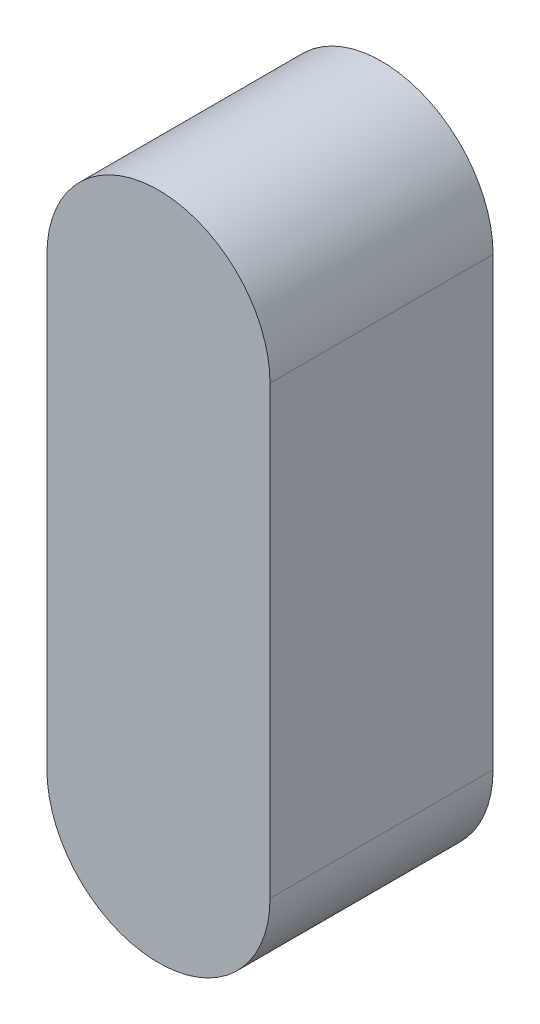
ISO-10303-21;
HEADER;
FILE_DESCRIPTION(('STEP AP214'),'2;1');
FILE_NAME('part.step','',(''),(''),'','','');
FILE_SCHEMA(('AUTOMOTIVE_DESIGN { 1 0 10303 214 1 1 1 1 }'));
ENDSEC;
DATA;
#1=APPLICATION_CONTEXT('core data for automotive mechanical design processes');
#2=APPLICATION_PROTOCOL_DEFINITION('international standard','automotive_design',2000,#1);
#3=PRODUCT_CONTEXT('',#1,'mechanical');
#4=PRODUCT('Part','Part','',(#3));
#5=PRODUCT_RELATED_PRODUCT_CATEGORY('part','',(#4));
#6=PRODUCT_DEFINITION_FORMATION('','',#4);
#7=PRODUCT_DEFINITION_CONTEXT('part definition',#1,'design');
#8=PRODUCT_DEFINITION('design','',#6,#7);
#9=PRODUCT_DEFINITION_SHAPE('','',#8);
#10=(LENGTH_UNIT() NAMED_UNIT(*) SI_UNIT(.MILLI.,.METRE.));
#11=(NAMED_UNIT(*) PLANE_ANGLE_UNIT() SI_UNIT($,.RADIAN.));
#12=(NAMED_UNIT(*) SI_UNIT($,.STERADIAN.) SOLID_ANGLE_UNIT());
#13=UNCERTAINTY_MEASURE_WITH_UNIT(LENGTH_MEASURE(1.E-05),#10,'distance_accuracy_value','');
#14=(GEOMETRIC_REPRESENTATION_CONTEXT(3) GLOBAL_UNCERTAINTY_ASSIGNED_CONTEXT((#13)) GLOBAL_UNIT_ASSIGNED_CONTEXT((#10,
#11,#12)) REPRESENTATION_CONTEXT('',''));
#15=CARTESIAN_POINT('',(0.,0.,0.));
#16=DIRECTION('',(0.,0.,1.));
#17=DIRECTION('',(1.,0.,0.));
#18=AXIS2_PLACEMENT_3D('',#15,#16,#17);
#19=CARTESIAN_POINT('',(0.,0.,5.));
#20=DIRECTION('',(0.,0.,-1.));
#21=DIRECTION('',(-1.,0.,0.));
#22=AXIS2_PLACEMENT_3D('',#19,#20,#21);
#23=CYLINDRICAL_SURFACE('',#22,2.5);
#24=CARTESIAN_POINT('',(0.,0.,0.));
#25=DIRECTION('',(0.,0.,1.));
#26=DIRECTION('',(1.,0.,0.));
#27=AXIS2_PLACEMENT_3D('',#24,#25,#26);
#28=CIRCLE('',#27,2.5);
#29=CARTESIAN_POINT('',(-2.5,0.,0.));
#30=VERTEX_POINT('',#29);
#31=CARTESIAN_POINT('',(2.5,0.,0.));
#32=VERTEX_POINT('',#31);
#33=EDGE_CURVE('E96',#30,#32,#28,.T.);
#34=ORIENTED_EDGE('',*,*,#33,.T.);
#35=DIRECTION('',(0.,0.,-1.));
#36=VECTOR('',#35,1.);
#37=CARTESIAN_POINT('',(2.5,0.,5.));
#38=LINE('',#37,#36);
#39=CARTESIAN_POINT('',(2.5,0.,5.));
#40=VERTEX_POINT('',#39);
#41=EDGE_CURVE('E11',#40,#32,#38,.T.);
#42=ORIENTED_EDGE('',*,*,#41,.F.);
#43=CARTESIAN_POINT('',(0.,0.,5.));
#44=DIRECTION('',(0.,0.,1.));
#45=DIRECTION('',(1.,0.,0.));
#46=AXIS2_PLACEMENT_3D('',#43,#44,#45);
#47=CIRCLE('',#46,2.5);
#48=CARTESIAN_POINT('',(-2.5,0.,5.));
#49=VERTEX_POINT('',#48);
#50=EDGE_CURVE('E84',#49,#40,#47,.T.);
#51=ORIENTED_EDGE('',*,*,#50,.F.);
#52=DIRECTION('',(0.,0.,-1.));
#53=VECTOR('',#52,1.);
#54=CARTESIAN_POINT('',(-2.5,0.,5.));
#55=LINE('',#54,#53);
#56=EDGE_CURVE('E92',#49,#30,#55,.T.);
#57=ORIENTED_EDGE('',*,*,#56,.T.);
#58=EDGE_LOOP('',(#34,#42,#51,#57));
#59=FACE_BOUND('',#58,.T.);
#60=ADVANCED_FACE('F33',(#59),#23,.T.);
#61=CARTESIAN_POINT('',(2.5,0.,5.));
#62=DIRECTION('',(-1.,0.,0.));
#63=DIRECTION('',(0.,0.,1.));
#64=AXIS2_PLACEMENT_3D('',#61,#62,#63);
#65=PLANE('',#64);
#66=DIRECTION('',(0.,1.,0.));
#67=VECTOR('',#66,1.);
#68=CARTESIAN_POINT('',(2.5,0.,0.));
#69=LINE('',#68,#67);
#70=CARTESIAN_POINT('',(2.5,10.,0.));
#71=VERTEX_POINT('',#70);
#72=EDGE_CURVE('E88',#32,#71,#69,.T.);
#73=ORIENTED_EDGE('',*,*,#72,.T.);
#74=DIRECTION('',(0.,0.,-1.));
#75=VECTOR('',#74,1.);
#76=CARTESIAN_POINT('',(2.5,10.,5.));
#77=LINE('',#76,#75);
#78=CARTESIAN_POINT('',(2.5,10.,5.));
#79=VERTEX_POINT('',#78);
#80=EDGE_CURVE('E41',#79,#71,#77,.T.);
#81=ORIENTED_EDGE('',*,*,#80,.F.);
#82=DIRECTION('',(0.,1.,0.));
#83=VECTOR('',#82,1.);
#84=CARTESIAN_POINT('',(2.5,0.,5.));
#85=LINE('',#84,#83);
#86=EDGE_CURVE('E79',#40,#79,#85,.T.);
#87=ORIENTED_EDGE('',*,*,#86,.F.);
#88=ORIENTED_EDGE('',*,*,#41,.T.);
#89=EDGE_LOOP('',(#73,#81,#87,#88));
#90=FACE_BOUND('',#89,.T.);
#91=ADVANCED_FACE('F87',(#90),#65,.F.);
#92=CARTESIAN_POINT('',(0.,10.,5.));
#93=DIRECTION('',(0.,0.,-1.));
#94=DIRECTION('',(-1.,0.,0.));
#95=AXIS2_PLACEMENT_3D('',#92,#93,#94);
#96=CYLINDRICAL_SURFACE('',#95,2.5);
#97=CARTESIAN_POINT('',(0.,10.,0.));
#98=DIRECTION('',(0.,0.,1.));
#99=DIRECTION('',(1.,0.,0.));
#100=AXIS2_PLACEMENT_3D('',#97,#98,#99);
#101=CIRCLE('',#100,2.5);
#102=CARTESIAN_POINT('',(-2.5,10.,0.));
#103=VERTEX_POINT('',#102);
#104=EDGE_CURVE('E66',#71,#103,#101,.T.);
#105=ORIENTED_EDGE('',*,*,#104,.T.);
#106=DIRECTION('',(0.,0.,-1.));
#107=VECTOR('',#106,1.);
#108=CARTESIAN_POINT('',(-2.5,10.,5.));
#109=LINE('',#108,#107);
#110=CARTESIAN_POINT('',(-2.5,10.,5.));
#111=VERTEX_POINT('',#110);
#112=EDGE_CURVE('E89',#111,#103,#109,.T.);
#113=ORIENTED_EDGE('',*,*,#112,.F.);
#114=CARTESIAN_POINT('',(0.,10.,5.));
#115=DIRECTION('',(0.,0.,1.));
#116=DIRECTION('',(1.,0.,0.));
#117=AXIS2_PLACEMENT_3D('',#114,#115,#116);
#118=CIRCLE('',#117,2.5);
#119=EDGE_CURVE('E82',#79,#111,#118,.T.);
#120=ORIENTED_EDGE('',*,*,#119,.F.);
#121=ORIENTED_EDGE('',*,*,#80,.T.);
#122=EDGE_LOOP('',(#105,#113,#120,#121));
#123=FACE_BOUND('',#122,.T.);
#124=ADVANCED_FACE('F90',(#123),#96,.T.);
#125=CARTESIAN_POINT('',(-2.5,0.,5.));
#126=DIRECTION('',(1.,0.,0.));
#127=DIRECTION('',(0.,0.,-1.));
#128=AXIS2_PLACEMENT_3D('',#125,#126,#127);
#129=PLANE('',#128);
#130=DIRECTION('',(0.,-1.,0.));
#131=VECTOR('',#130,1.);
#132=CARTESIAN_POINT('',(-2.5,0.,0.));
#133=LINE('',#132,#131);
#134=EDGE_CURVE('E72',#103,#30,#133,.T.);
#135=ORIENTED_EDGE('',*,*,#134,.T.);
#136=ORIENTED_EDGE('',*,*,#56,.F.);
#137=DIRECTION('',(0.,-1.,0.));
#138=VECTOR('',#137,1.);
#139=CARTESIAN_POINT('',(-2.5,0.,5.));
#140=LINE('',#139,#138);
#141=EDGE_CURVE('E49',#111,#49,#140,.T.);
#142=ORIENTED_EDGE('',*,*,#141,.F.);
#143=ORIENTED_EDGE('',*,*,#112,.T.);
#144=EDGE_LOOP('',(#135,#136,#142,#143));
#145=FACE_BOUND('',#144,.T.);
#146=ADVANCED_FACE('F103',(#145),#129,.F.);
#147=CARTESIAN_POINT('',(0.,0.,5.));
#148=DIRECTION('',(0.,0.,1.));
#149=DIRECTION('',(1.,0.,0.));
#150=AXIS2_PLACEMENT_3D('',#147,#148,#149);
#151=PLANE('',#150);
#152=ORIENTED_EDGE('',*,*,#50,.T.);
#153=ORIENTED_EDGE('',*,*,#86,.T.);
#154=ORIENTED_EDGE('',*,*,#119,.T.);
#155=ORIENTED_EDGE('',*,*,#141,.T.);
#156=EDGE_LOOP('',(#152,#153,#154,#155));
#157=FACE_BOUND('',#156,.T.);
#158=ADVANCED_FACE('F80',(#157),#151,.T.);
#159=CARTESIAN_POINT('',(0.,0.,0.));
#160=DIRECTION('',(0.,0.,1.));
#161=DIRECTION('',(1.,0.,0.));
#162=AXIS2_PLACEMENT_3D('',#159,#160,#161);
#163=PLANE('',#162);
#164=ORIENTED_EDGE('',*,*,#33,.F.);
#165=ORIENTED_EDGE('',*,*,#134,.F.);
#166=ORIENTED_EDGE('',*,*,#104,.F.);
#167=ORIENTED_EDGE('',*,*,#72,.F.);
#168=EDGE_LOOP('',(#164,#165,#166,#167));
#169=FACE_BOUND('',#168,.T.);
#170=ADVANCED_FACE('F106',(#169),#163,.F.);
#171=CLOSED_SHELL('',(#60,#91,#124,#146,#158,#170));
#172=MANIFOLD_SOLID_BREP('B2',#171);
#173=ADVANCED_BREP_SHAPE_REPRESENTATION('',(#18,#172),#14);
#174=SHAPE_DEFINITION_REPRESENTATION(#9,#173);
ENDSEC;
END-ISO-10303-21;
